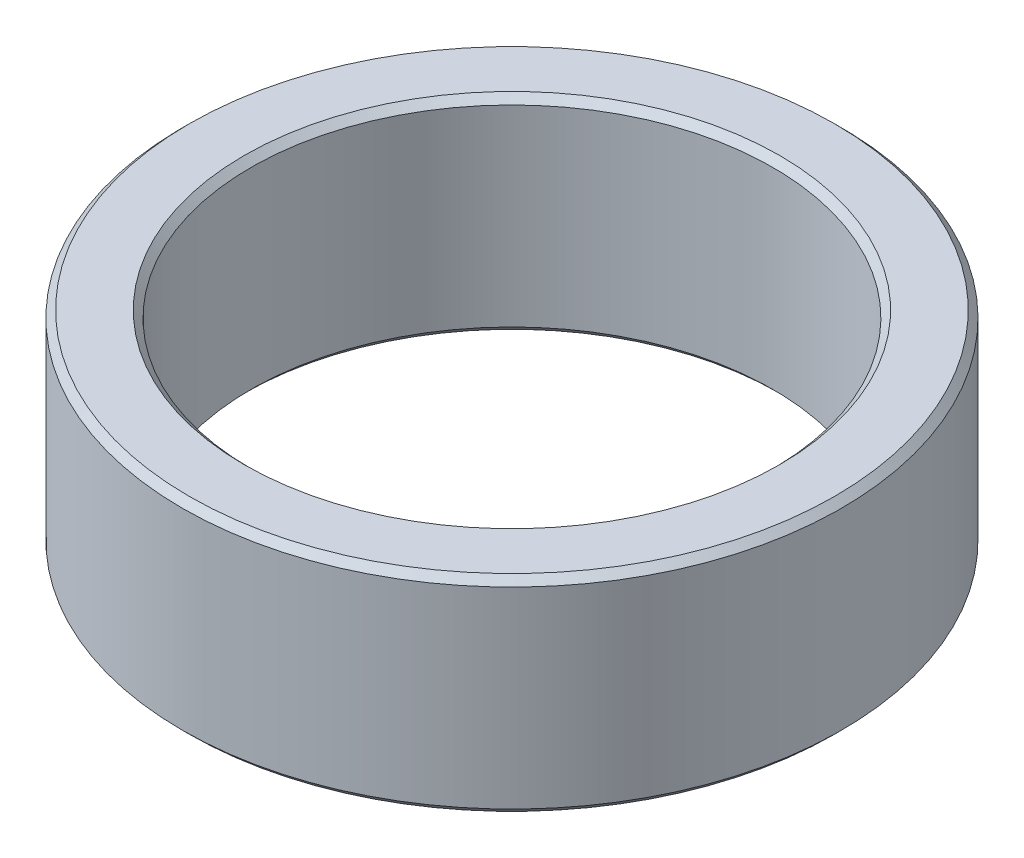
ISO-10303-21;
HEADER;
FILE_DESCRIPTION(('STEP AP214'),'2;1');
FILE_NAME('part.step','',(''),(''),'','','');
FILE_SCHEMA(('AUTOMOTIVE_DESIGN { 1 0 10303 214 1 1 1 1 }'));
ENDSEC;
DATA;
#1=APPLICATION_CONTEXT('core data for automotive mechanical design processes');
#2=APPLICATION_PROTOCOL_DEFINITION('international standard','automotive_design',2000,#1);
#3=PRODUCT_CONTEXT('',#1,'mechanical');
#4=PRODUCT('Part','Part','',(#3));
#5=PRODUCT_RELATED_PRODUCT_CATEGORY('part','',(#4));
#6=PRODUCT_DEFINITION_FORMATION('','',#4);
#7=PRODUCT_DEFINITION_CONTEXT('part definition',#1,'design');
#8=PRODUCT_DEFINITION('design','',#6,#7);
#9=PRODUCT_DEFINITION_SHAPE('','',#8);
#10=(LENGTH_UNIT() NAMED_UNIT(*) SI_UNIT(.MILLI.,.METRE.));
#11=(NAMED_UNIT(*) PLANE_ANGLE_UNIT() SI_UNIT($,.RADIAN.));
#12=(NAMED_UNIT(*) SI_UNIT($,.STERADIAN.) SOLID_ANGLE_UNIT());
#13=UNCERTAINTY_MEASURE_WITH_UNIT(LENGTH_MEASURE(1.E-05),#10,'distance_accuracy_value','');
#14=(GEOMETRIC_REPRESENTATION_CONTEXT(3) GLOBAL_UNCERTAINTY_ASSIGNED_CONTEXT((#13)) GLOBAL_UNIT_ASSIGNED_CONTEXT((#10,
#11,#12)) REPRESENTATION_CONTEXT('',''));
#15=CARTESIAN_POINT('',(0.,0.,0.));
#16=DIRECTION('',(0.,0.,1.));
#17=DIRECTION('',(1.,0.,0.));
#18=AXIS2_PLACEMENT_3D('',#15,#16,#17);
#19=CARTESIAN_POINT('',(0.,15.,0.));
#20=DIRECTION('',(0.,1.,0.));
#21=DIRECTION('',(0.,0.,1.));
#22=AXIS2_PLACEMENT_3D('',#19,#20,#21);
#23=PLANE('',#22);
#24=CARTESIAN_POINT('',(0.,15.,0.));
#25=DIRECTION('',(0.,1.,0.));
#26=DIRECTION('',(0.,0.,1.));
#27=AXIS2_PLACEMENT_3D('',#24,#25,#26);
#28=CIRCLE('',#27,19.5);
#29=CARTESIAN_POINT('',(0.,15.,19.5));
#30=VERTEX_POINT('',#29);
#31=EDGE_CURVE('E10',#30,#30,#28,.F.);
#32=ORIENTED_EDGE('',*,*,#31,.T.);
#33=EDGE_LOOP('',(#32));
#34=FACE_BOUND('',#33,.T.);
#35=CARTESIAN_POINT('',(0.,15.,0.));
#36=DIRECTION('',(0.,1.,0.));
#37=DIRECTION('',(0.,0.,1.));
#38=AXIS2_PLACEMENT_3D('',#35,#36,#37);
#39=CIRCLE('',#38,23.5);
#40=CARTESIAN_POINT('',(0.,15.,23.5));
#41=VERTEX_POINT('',#40);
#42=EDGE_CURVE('E51',#41,#41,#39,.T.);
#43=ORIENTED_EDGE('',*,*,#42,.T.);
#44=EDGE_LOOP('',(#43));
#45=FACE_BOUND('',#44,.T.);
#46=ADVANCED_FACE('F42',(#34,#45),#23,.T.);
#47=CARTESIAN_POINT('',(0.,0.,0.));
#48=DIRECTION('',(0.,1.,0.));
#49=DIRECTION('',(0.,0.,1.));
#50=AXIS2_PLACEMENT_3D('',#47,#48,#49);
#51=PLANE('',#50);
#52=CARTESIAN_POINT('',(0.,0.,0.));
#53=DIRECTION('',(0.,1.,0.));
#54=DIRECTION('',(0.,0.,1.));
#55=AXIS2_PLACEMENT_3D('',#52,#53,#54);
#56=CIRCLE('',#55,19.5);
#57=CARTESIAN_POINT('',(0.,0.,19.5));
#58=VERTEX_POINT('',#57);
#59=EDGE_CURVE('E75',#58,#58,#56,.T.);
#60=ORIENTED_EDGE('',*,*,#59,.T.);
#61=EDGE_LOOP('',(#60));
#62=FACE_BOUND('',#61,.T.);
#63=CARTESIAN_POINT('',(0.,0.,0.));
#64=DIRECTION('',(0.,1.,0.));
#65=DIRECTION('',(0.,0.,1.));
#66=AXIS2_PLACEMENT_3D('',#63,#64,#65);
#67=CIRCLE('',#66,23.5);
#68=CARTESIAN_POINT('',(0.,0.,23.5));
#69=VERTEX_POINT('',#68);
#70=EDGE_CURVE('E79',#69,#69,#67,.F.);
#71=ORIENTED_EDGE('',*,*,#70,.T.);
#72=EDGE_LOOP('',(#71));
#73=FACE_BOUND('',#72,.T.);
#74=ADVANCED_FACE('F84',(#62,#73),#51,.F.);
#75=CARTESIAN_POINT('',(0.,15.,0.));
#76=DIRECTION('',(0.,-1.,0.));
#77=DIRECTION('',(0.,0.,-1.));
#78=AXIS2_PLACEMENT_3D('',#75,#76,#77);
#79=CYLINDRICAL_SURFACE('',#78,24.);
#80=CARTESIAN_POINT('',(0.,0.499999999999997,0.));
#81=DIRECTION('',(0.,1.,0.));
#82=DIRECTION('',(0.,0.,1.));
#83=AXIS2_PLACEMENT_3D('',#80,#81,#82);
#84=CIRCLE('',#83,24.);
#85=CARTESIAN_POINT('',(0.,0.499999999999997,24.));
#86=VERTEX_POINT('',#85);
#87=EDGE_CURVE('E56',#86,#86,#84,.T.);
#88=ORIENTED_EDGE('',*,*,#87,.T.);
#89=EDGE_LOOP('',(#88));
#90=FACE_BOUND('',#89,.T.);
#91=CARTESIAN_POINT('',(0.,14.5,0.));
#92=DIRECTION('',(0.,1.,0.));
#93=DIRECTION('',(0.,0.,1.));
#94=AXIS2_PLACEMENT_3D('',#91,#92,#93);
#95=CIRCLE('',#94,24.);
#96=CARTESIAN_POINT('',(0.,14.5,24.));
#97=VERTEX_POINT('',#96);
#98=EDGE_CURVE('E61',#97,#97,#95,.F.);
#99=ORIENTED_EDGE('',*,*,#98,.T.);
#100=EDGE_LOOP('',(#99));
#101=FACE_BOUND('',#100,.T.);
#102=ADVANCED_FACE('F94',(#90,#101),#79,.T.);
#103=CARTESIAN_POINT('',(0.,15.,0.));
#104=DIRECTION('',(0.,-1.,0.));
#105=DIRECTION('',(0.,0.,-1.));
#106=AXIS2_PLACEMENT_3D('',#103,#104,#105);
#107=CYLINDRICAL_SURFACE('',#106,19.);
#108=CARTESIAN_POINT('',(0.,0.5,0.));
#109=DIRECTION('',(0.,1.,0.));
#110=DIRECTION('',(0.,0.,1.));
#111=AXIS2_PLACEMENT_3D('',#108,#109,#110);
#112=CIRCLE('',#111,19.);
#113=CARTESIAN_POINT('',(0.,0.5,19.));
#114=VERTEX_POINT('',#113);
#115=EDGE_CURVE('E67',#114,#114,#112,.F.);
#116=ORIENTED_EDGE('',*,*,#115,.T.);
#117=EDGE_LOOP('',(#116));
#118=FACE_BOUND('',#117,.T.);
#119=CARTESIAN_POINT('',(0.,14.5,0.));
#120=DIRECTION('',(0.,1.,0.));
#121=DIRECTION('',(0.,0.,1.));
#122=AXIS2_PLACEMENT_3D('',#119,#120,#121);
#123=CIRCLE('',#122,19.);
#124=CARTESIAN_POINT('',(0.,14.5,19.));
#125=VERTEX_POINT('',#124);
#126=EDGE_CURVE('E71',#125,#125,#123,.T.);
#127=ORIENTED_EDGE('',*,*,#126,.T.);
#128=EDGE_LOOP('',(#127));
#129=FACE_BOUND('',#128,.T.);
#130=ADVANCED_FACE('F97',(#118,#129),#107,.F.);
#131=CARTESIAN_POINT('',(0.,0.,0.));
#132=DIRECTION('',(0.,-1.,0.));
#133=DIRECTION('',(0.,0.,-1.));
#134=AXIS2_PLACEMENT_3D('',#131,#132,#133);
#135=CONICAL_SURFACE('',#134,19.5,0.785398163397438);
#136=ORIENTED_EDGE('',*,*,#115,.F.);
#137=EDGE_LOOP('',(#136));
#138=FACE_BOUND('',#137,.T.);
#139=ORIENTED_EDGE('',*,*,#59,.F.);
#140=EDGE_LOOP('',(#139));
#141=FACE_BOUND('',#140,.T.);
#142=ADVANCED_FACE('F90',(#138,#141),#135,.F.);
#143=CARTESIAN_POINT('',(0.,0.499999999999997,0.));
#144=DIRECTION('',(0.,1.,0.));
#145=DIRECTION('',(0.,0.,1.));
#146=AXIS2_PLACEMENT_3D('',#143,#144,#145);
#147=CONICAL_SURFACE('',#146,24.,0.785398163397448);
#148=ORIENTED_EDGE('',*,*,#70,.F.);
#149=EDGE_LOOP('',(#148));
#150=FACE_BOUND('',#149,.T.);
#151=ORIENTED_EDGE('',*,*,#87,.F.);
#152=EDGE_LOOP('',(#151));
#153=FACE_BOUND('',#152,.T.);
#154=ADVANCED_FACE('F86',(#150,#153),#147,.T.);
#155=CARTESIAN_POINT('',(0.,14.5,0.));
#156=DIRECTION('',(0.,1.,0.));
#157=DIRECTION('',(0.,0.,1.));
#158=AXIS2_PLACEMENT_3D('',#155,#156,#157);
#159=CONICAL_SURFACE('',#158,19.,0.785398163397452);
#160=ORIENTED_EDGE('',*,*,#31,.F.);
#161=EDGE_LOOP('',(#160));
#162=FACE_BOUND('',#161,.T.);
#163=ORIENTED_EDGE('',*,*,#126,.F.);
#164=EDGE_LOOP('',(#163));
#165=FACE_BOUND('',#164,.T.);
#166=ADVANCED_FACE('F89',(#162,#165),#159,.F.);
#167=CARTESIAN_POINT('',(0.,15.,0.));
#168=DIRECTION('',(0.,-1.,0.));
#169=DIRECTION('',(0.,0.,-1.));
#170=AXIS2_PLACEMENT_3D('',#167,#168,#169);
#171=CONICAL_SURFACE('',#170,23.5,0.785398163397445);
#172=ORIENTED_EDGE('',*,*,#98,.F.);
#173=EDGE_LOOP('',(#172));
#174=FACE_BOUND('',#173,.T.);
#175=ORIENTED_EDGE('',*,*,#42,.F.);
#176=EDGE_LOOP('',(#175));
#177=FACE_BOUND('',#176,.T.);
#178=ADVANCED_FACE('F45',(#174,#177),#171,.T.);
#179=CLOSED_SHELL('',(#46,#74,#102,#130,#142,#154,#166,#178));
#180=MANIFOLD_SOLID_BREP('B2',#179);
#181=ADVANCED_BREP_SHAPE_REPRESENTATION('',(#18,#180),#14);
#182=SHAPE_DEFINITION_REPRESENTATION(#9,#181);
ENDSEC;
END-ISO-10303-21;
